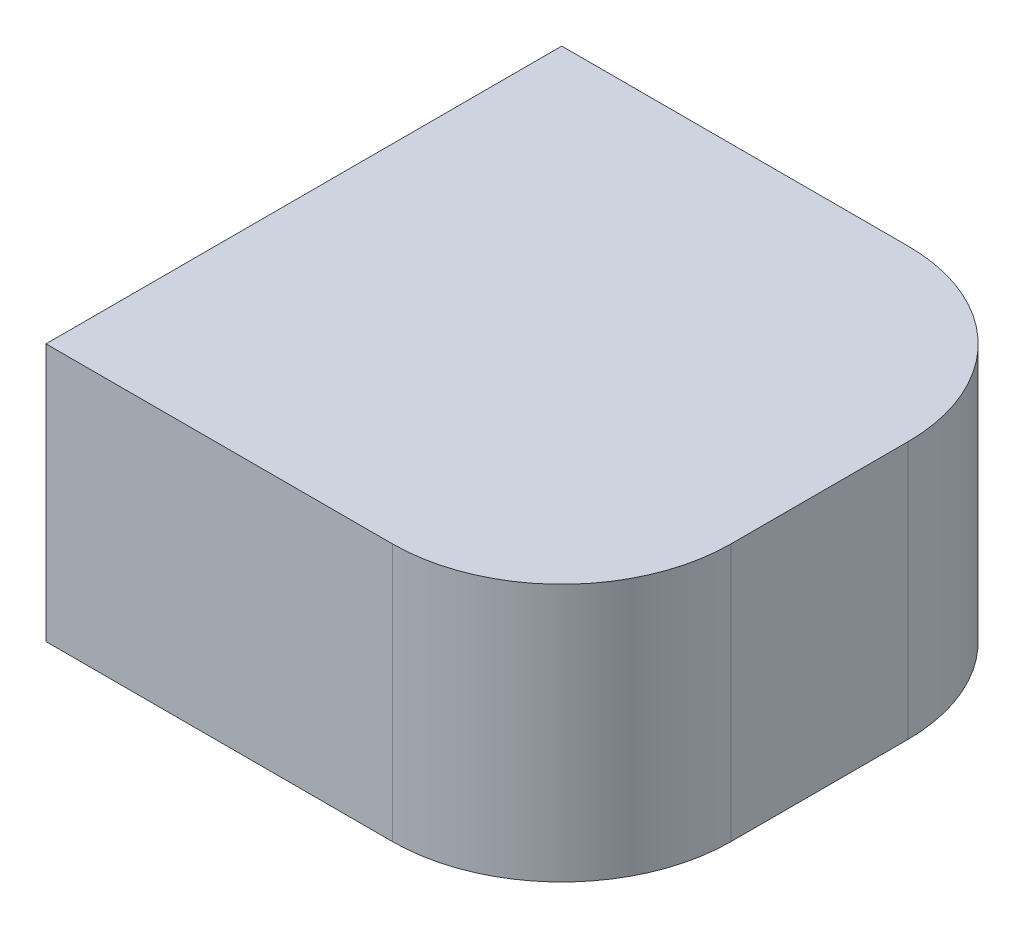
ISO-10303-21;
HEADER;
FILE_DESCRIPTION(('STEP AP214'),'2;1');
FILE_NAME('part.step','',(''),(''),'','','');
FILE_SCHEMA(('AUTOMOTIVE_DESIGN { 1 0 10303 214 1 1 1 1 }'));
ENDSEC;
DATA;
#1=APPLICATION_CONTEXT('core data for automotive mechanical design processes');
#2=APPLICATION_PROTOCOL_DEFINITION('international standard','automotive_design',2000,#1);
#3=PRODUCT_CONTEXT('',#1,'mechanical');
#4=PRODUCT('Part','Part','',(#3));
#5=PRODUCT_RELATED_PRODUCT_CATEGORY('part','',(#4));
#6=PRODUCT_DEFINITION_FORMATION('','',#4);
#7=PRODUCT_DEFINITION_CONTEXT('part definition',#1,'design');
#8=PRODUCT_DEFINITION('design','',#6,#7);
#9=PRODUCT_DEFINITION_SHAPE('','',#8);
#10=(LENGTH_UNIT() NAMED_UNIT(*) SI_UNIT(.MILLI.,.METRE.));
#11=(NAMED_UNIT(*) PLANE_ANGLE_UNIT() SI_UNIT($,.RADIAN.));
#12=(NAMED_UNIT(*) SI_UNIT($,.STERADIAN.) SOLID_ANGLE_UNIT());
#13=UNCERTAINTY_MEASURE_WITH_UNIT(LENGTH_MEASURE(1.E-05),#10,'distance_accuracy_value','');
#14=(GEOMETRIC_REPRESENTATION_CONTEXT(3) GLOBAL_UNCERTAINTY_ASSIGNED_CONTEXT((#13)) GLOBAL_UNIT_ASSIGNED_CONTEXT((#10,
#11,#12)) REPRESENTATION_CONTEXT('',''));
#15=CARTESIAN_POINT('',(0.,0.,0.));
#16=DIRECTION('',(0.,0.,1.));
#17=DIRECTION('',(1.,0.,0.));
#18=AXIS2_PLACEMENT_3D('',#15,#16,#17);
#19=CARTESIAN_POINT('',(-70.,35.,0.));
#20=DIRECTION('',(1.,0.,0.));
#21=DIRECTION('',(0.,0.,-1.));
#22=AXIS2_PLACEMENT_3D('',#19,#20,#21);
#23=PLANE('',#22);
#24=DIRECTION('',(0.,0.,1.));
#25=VECTOR('',#24,1.);
#26=CARTESIAN_POINT('',(-70.,0.,0.));
#27=LINE('',#26,#25);
#28=CARTESIAN_POINT('',(-70.,0.,0.));
#29=VERTEX_POINT('',#28);
#30=CARTESIAN_POINT('',(-70.,0.,70.));
#31=VERTEX_POINT('',#30);
#32=EDGE_CURVE('E140',#29,#31,#27,.T.);
#33=ORIENTED_EDGE('',*,*,#32,.T.);
#34=DIRECTION('',(0.,-1.,0.));
#35=VECTOR('',#34,1.);
#36=CARTESIAN_POINT('',(-70.,35.,70.));
#37=LINE('',#36,#35);
#38=CARTESIAN_POINT('',(-70.,35.,70.));
#39=VERTEX_POINT('',#38);
#40=EDGE_CURVE('E11',#39,#31,#37,.T.);
#41=ORIENTED_EDGE('',*,*,#40,.F.);
#42=DIRECTION('',(0.,0.,1.));
#43=VECTOR('',#42,1.);
#44=CARTESIAN_POINT('',(-70.,35.,0.));
#45=LINE('',#44,#43);
#46=CARTESIAN_POINT('',(-70.,35.,0.));
#47=VERTEX_POINT('',#46);
#48=EDGE_CURVE('E158',#47,#39,#45,.T.);
#49=ORIENTED_EDGE('',*,*,#48,.F.);
#50=DIRECTION('',(0.,-1.,0.));
#51=VECTOR('',#50,1.);
#52=CARTESIAN_POINT('',(-70.,35.,0.));
#53=LINE('',#52,#51);
#54=EDGE_CURVE('E136',#47,#29,#53,.T.);
#55=ORIENTED_EDGE('',*,*,#54,.T.);
#56=EDGE_LOOP('',(#33,#41,#49,#55));
#57=FACE_BOUND('',#56,.T.);
#58=ADVANCED_FACE('F39',(#57),#23,.F.);
#59=CARTESIAN_POINT('',(-23.,35.,70.));
#60=DIRECTION('',(0.,0.,-1.));
#61=DIRECTION('',(-1.,0.,0.));
#62=AXIS2_PLACEMENT_3D('',#59,#60,#61);
#63=PLANE('',#62);
#64=DIRECTION('',(1.,0.,0.));
#65=VECTOR('',#64,1.);
#66=CARTESIAN_POINT('',(-23.,0.,70.));
#67=LINE('',#66,#65);
#68=CARTESIAN_POINT('',(-23.,0.,70.));
#69=VERTEX_POINT('',#68);
#70=EDGE_CURVE('E144',#31,#69,#67,.T.);
#71=ORIENTED_EDGE('',*,*,#70,.T.);
#72=DIRECTION('',(0.,-1.,0.));
#73=VECTOR('',#72,1.);
#74=CARTESIAN_POINT('',(-23.,35.,70.));
#75=LINE('',#74,#73);
#76=CARTESIAN_POINT('',(-23.,35.,70.));
#77=VERTEX_POINT('',#76);
#78=EDGE_CURVE('E47',#77,#69,#75,.T.);
#79=ORIENTED_EDGE('',*,*,#78,.F.);
#80=DIRECTION('',(1.,0.,0.));
#81=VECTOR('',#80,1.);
#82=CARTESIAN_POINT('',(-23.,35.,70.));
#83=LINE('',#82,#81);
#84=EDGE_CURVE('E98',#39,#77,#83,.T.);
#85=ORIENTED_EDGE('',*,*,#84,.F.);
#86=ORIENTED_EDGE('',*,*,#40,.T.);
#87=EDGE_LOOP('',(#71,#79,#85,#86));
#88=FACE_BOUND('',#87,.T.);
#89=ADVANCED_FACE('F264',(#88),#63,.F.);
#90=CARTESIAN_POINT('',(-23.,35.,47.));
#91=DIRECTION('',(0.,-1.,0.));
#92=DIRECTION('',(0.,0.,-1.));
#93=AXIS2_PLACEMENT_3D('',#90,#91,#92);
#94=CYLINDRICAL_SURFACE('',#93,23.);
#95=CARTESIAN_POINT('',(-23.,0.,47.));
#96=DIRECTION('',(0.,1.,0.));
#97=DIRECTION('',(0.,0.,-1.));
#98=AXIS2_PLACEMENT_3D('',#95,#96,#97);
#99=CIRCLE('',#98,23.);
#100=CARTESIAN_POINT('',(0.,0.,47.));
#101=VERTEX_POINT('',#100);
#102=EDGE_CURVE('E148',#69,#101,#99,.T.);
#103=ORIENTED_EDGE('',*,*,#102,.T.);
#104=DIRECTION('',(0.,-1.,0.));
#105=VECTOR('',#104,1.);
#106=CARTESIAN_POINT('',(0.,35.,47.));
#107=LINE('',#106,#105);
#108=CARTESIAN_POINT('',(0.,35.,47.));
#109=VERTEX_POINT('',#108);
#110=EDGE_CURVE('E129',#109,#101,#107,.T.);
#111=ORIENTED_EDGE('',*,*,#110,.F.);
#112=CARTESIAN_POINT('',(-23.,35.,47.));
#113=DIRECTION('',(0.,1.,0.));
#114=DIRECTION('',(0.,0.,-1.));
#115=AXIS2_PLACEMENT_3D('',#112,#113,#114);
#116=CIRCLE('',#115,23.);
#117=EDGE_CURVE('E115',#77,#109,#116,.T.);
#118=ORIENTED_EDGE('',*,*,#117,.F.);
#119=ORIENTED_EDGE('',*,*,#78,.T.);
#120=EDGE_LOOP('',(#103,#111,#118,#119));
#121=FACE_BOUND('',#120,.T.);
#122=ADVANCED_FACE('F168',(#121),#94,.T.);
#123=CARTESIAN_POINT('',(0.,35.,23.0000000000002));
#124=DIRECTION('',(-1.,0.,0.));
#125=DIRECTION('',(0.,0.,1.));
#126=AXIS2_PLACEMENT_3D('',#123,#124,#125);
#127=PLANE('',#126);
#128=DIRECTION('',(0.,0.,-1.));
#129=VECTOR('',#128,1.);
#130=CARTESIAN_POINT('',(0.,0.,23.0000000000002));
#131=LINE('',#130,#129);
#132=CARTESIAN_POINT('',(0.,0.,23.0000000000002));
#133=VERTEX_POINT('',#132);
#134=EDGE_CURVE('E125',#101,#133,#131,.T.);
#135=ORIENTED_EDGE('',*,*,#134,.T.);
#136=DIRECTION('',(0.,-1.,0.));
#137=VECTOR('',#136,1.);
#138=CARTESIAN_POINT('',(0.,35.,23.0000000000002));
#139=LINE('',#138,#137);
#140=CARTESIAN_POINT('',(0.,35.,23.0000000000002));
#141=VERTEX_POINT('',#140);
#142=EDGE_CURVE('E122',#141,#133,#139,.T.);
#143=ORIENTED_EDGE('',*,*,#142,.F.);
#144=DIRECTION('',(0.,0.,-1.));
#145=VECTOR('',#144,1.);
#146=CARTESIAN_POINT('',(0.,35.,23.0000000000002));
#147=LINE('',#146,#145);
#148=EDGE_CURVE('E108',#109,#141,#147,.T.);
#149=ORIENTED_EDGE('',*,*,#148,.F.);
#150=ORIENTED_EDGE('',*,*,#110,.T.);
#151=EDGE_LOOP('',(#135,#143,#149,#150));
#152=FACE_BOUND('',#151,.T.);
#153=ADVANCED_FACE('F123',(#152),#127,.F.);
#154=CARTESIAN_POINT('',(-23.,35.,23.));
#155=DIRECTION('',(0.,-1.,0.));
#156=DIRECTION('',(0.,0.,-1.));
#157=AXIS2_PLACEMENT_3D('',#154,#155,#156);
#158=CYLINDRICAL_SURFACE('',#157,23.);
#159=CARTESIAN_POINT('',(-23.,0.,23.));
#160=DIRECTION('',(0.,1.,0.));
#161=DIRECTION('',(0.,0.,-1.));
#162=AXIS2_PLACEMENT_3D('',#159,#160,#161);
#163=CIRCLE('',#162,23.);
#164=CARTESIAN_POINT('',(-23.0000000000002,0.,0.));
#165=VERTEX_POINT('',#164);
#166=EDGE_CURVE('E153',#133,#165,#163,.T.);
#167=ORIENTED_EDGE('',*,*,#166,.T.);
#168=DIRECTION('',(0.,-1.,0.));
#169=VECTOR('',#168,1.);
#170=CARTESIAN_POINT('',(-23.0000000000002,35.,0.));
#171=LINE('',#170,#169);
#172=CARTESIAN_POINT('',(-23.0000000000002,35.,0.));
#173=VERTEX_POINT('',#172);
#174=EDGE_CURVE('E130',#173,#165,#171,.T.);
#175=ORIENTED_EDGE('',*,*,#174,.F.);
#176=CARTESIAN_POINT('',(-23.,35.,23.));
#177=DIRECTION('',(0.,1.,0.));
#178=DIRECTION('',(0.,0.,-1.));
#179=AXIS2_PLACEMENT_3D('',#176,#177,#178);
#180=CIRCLE('',#179,23.);
#181=EDGE_CURVE('E112',#141,#173,#180,.T.);
#182=ORIENTED_EDGE('',*,*,#181,.F.);
#183=ORIENTED_EDGE('',*,*,#142,.T.);
#184=EDGE_LOOP('',(#167,#175,#182,#183));
#185=FACE_BOUND('',#184,.T.);
#186=ADVANCED_FACE('F132',(#185),#158,.T.);
#187=CARTESIAN_POINT('',(-23.0000000000002,35.,0.));
#188=DIRECTION('',(0.,0.,1.));
#189=DIRECTION('',(1.,0.,0.));
#190=AXIS2_PLACEMENT_3D('',#187,#188,#189);
#191=PLANE('',#190);
#192=DIRECTION('',(-1.,0.,0.));
#193=VECTOR('',#192,1.);
#194=CARTESIAN_POINT('',(-65.,5.5,0.));
#195=LINE('',#194,#193);
#196=CARTESIAN_POINT('',(-65.,5.5,0.));
#197=VERTEX_POINT('',#196);
#198=CARTESIAN_POINT('',(-68.,5.5,0.));
#199=VERTEX_POINT('',#198);
#200=EDGE_CURVE('E205',#197,#199,#195,.T.);
#201=ORIENTED_EDGE('',*,*,#200,.F.);
#202=DIRECTION('',(0.,-1.,0.));
#203=VECTOR('',#202,1.);
#204=CARTESIAN_POINT('',(-65.,29.5,0.));
#205=LINE('',#204,#203);
#206=CARTESIAN_POINT('',(-65.,29.5,0.));
#207=VERTEX_POINT('',#206);
#208=EDGE_CURVE('E54',#207,#197,#205,.T.);
#209=ORIENTED_EDGE('',*,*,#208,.F.);
#210=DIRECTION('',(1.,0.,0.));
#211=VECTOR('',#210,1.);
#212=CARTESIAN_POINT('',(-65.,29.5,0.));
#213=LINE('',#212,#211);
#214=CARTESIAN_POINT('',(-68.,29.5,0.));
#215=VERTEX_POINT('',#214);
#216=EDGE_CURVE('E196',#215,#207,#213,.T.);
#217=ORIENTED_EDGE('',*,*,#216,.F.);
#218=DIRECTION('',(0.,1.,0.));
#219=VECTOR('',#218,1.);
#220=CARTESIAN_POINT('',(-68.,29.5,0.));
#221=LINE('',#220,#219);
#222=EDGE_CURVE('E201',#199,#215,#221,.T.);
#223=ORIENTED_EDGE('',*,*,#222,.F.);
#224=EDGE_LOOP('',(#201,#209,#217,#223));
#225=FACE_BOUND('',#224,.T.);
#226=DIRECTION('',(-1.,0.,0.));
#227=VECTOR('',#226,1.);
#228=CARTESIAN_POINT('',(-23.0000000000002,0.,0.));
#229=LINE('',#228,#227);
#230=EDGE_CURVE('E90',#165,#29,#229,.T.);
#231=ORIENTED_EDGE('',*,*,#230,.T.);
#232=ORIENTED_EDGE('',*,*,#54,.F.);
#233=DIRECTION('',(-1.,0.,0.));
#234=VECTOR('',#233,1.);
#235=CARTESIAN_POINT('',(-23.0000000000002,35.,0.));
#236=LINE('',#235,#234);
#237=EDGE_CURVE('E63',#173,#47,#236,.T.);
#238=ORIENTED_EDGE('',*,*,#237,.F.);
#239=ORIENTED_EDGE('',*,*,#174,.T.);
#240=EDGE_LOOP('',(#231,#232,#238,#239));
#241=FACE_BOUND('',#240,.T.);
#242=ADVANCED_FACE('F172',(#225,#241),#191,.F.);
#243=CARTESIAN_POINT('',(-23.,35.,47.));
#244=DIRECTION('',(0.,-1.,0.));
#245=DIRECTION('',(0.,0.,-1.));
#246=AXIS2_PLACEMENT_3D('',#243,#244,#245);
#247=PLANE('',#246);
#248=ORIENTED_EDGE('',*,*,#48,.T.);
#249=ORIENTED_EDGE('',*,*,#84,.T.);
#250=ORIENTED_EDGE('',*,*,#117,.T.);
#251=ORIENTED_EDGE('',*,*,#148,.T.);
#252=ORIENTED_EDGE('',*,*,#181,.T.);
#253=ORIENTED_EDGE('',*,*,#237,.T.);
#254=EDGE_LOOP('',(#248,#249,#250,#251,#252,#253));
#255=FACE_BOUND('',#254,.T.);
#256=ADVANCED_FACE('F110',(#255),#247,.F.);
#257=CARTESIAN_POINT('',(-23.,0.,47.));
#258=DIRECTION('',(0.,-1.,0.));
#259=DIRECTION('',(0.,0.,-1.));
#260=AXIS2_PLACEMENT_3D('',#257,#258,#259);
#261=PLANE('',#260);
#262=ORIENTED_EDGE('',*,*,#32,.F.);
#263=ORIENTED_EDGE('',*,*,#230,.F.);
#264=ORIENTED_EDGE('',*,*,#166,.F.);
#265=ORIENTED_EDGE('',*,*,#134,.F.);
#266=ORIENTED_EDGE('',*,*,#102,.F.);
#267=ORIENTED_EDGE('',*,*,#70,.F.);
#268=EDGE_LOOP('',(#262,#263,#264,#265,#266,#267));
#269=FACE_BOUND('',#268,.T.);
#270=ADVANCED_FACE('F171',(#269),#261,.T.);
#271=CARTESIAN_POINT('',(-65.,29.5,22.));
#272=DIRECTION('',(1.,0.,0.));
#273=DIRECTION('',(0.,0.,-1.));
#274=AXIS2_PLACEMENT_3D('',#271,#272,#273);
#275=PLANE('',#274);
#276=ORIENTED_EDGE('',*,*,#208,.T.);
#277=DIRECTION('',(0.,0.,-1.));
#278=VECTOR('',#277,1.);
#279=CARTESIAN_POINT('',(-65.,5.5,22.));
#280=LINE('',#279,#278);
#281=CARTESIAN_POINT('',(-65.,5.5,22.));
#282=VERTEX_POINT('',#281);
#283=EDGE_CURVE('E181',#282,#197,#280,.T.);
#284=ORIENTED_EDGE('',*,*,#283,.F.);
#285=DIRECTION('',(0.,-1.,0.));
#286=VECTOR('',#285,1.);
#287=CARTESIAN_POINT('',(-65.,29.5,22.));
#288=LINE('',#287,#286);
#289=CARTESIAN_POINT('',(-65.,29.5,22.));
#290=VERTEX_POINT('',#289);
#291=EDGE_CURVE('E200',#290,#282,#288,.T.);
#292=ORIENTED_EDGE('',*,*,#291,.F.);
#293=DIRECTION('',(0.,0.,-1.));
#294=VECTOR('',#293,1.);
#295=CARTESIAN_POINT('',(-65.,29.5,22.));
#296=LINE('',#295,#294);
#297=EDGE_CURVE('E145',#290,#207,#296,.T.);
#298=ORIENTED_EDGE('',*,*,#297,.T.);
#299=EDGE_LOOP('',(#276,#284,#292,#298));
#300=FACE_BOUND('',#299,.T.);
#301=ADVANCED_FACE('F232',(#300),#275,.F.);
#302=CARTESIAN_POINT('',(-65.,29.5,22.));
#303=DIRECTION('',(0.,1.,0.));
#304=DIRECTION('',(0.,0.,1.));
#305=AXIS2_PLACEMENT_3D('',#302,#303,#304);
#306=PLANE('',#305);
#307=ORIENTED_EDGE('',*,*,#216,.T.);
#308=ORIENTED_EDGE('',*,*,#297,.F.);
#309=DIRECTION('',(1.,0.,0.));
#310=VECTOR('',#309,1.);
#311=CARTESIAN_POINT('',(-65.,29.5,22.));
#312=LINE('',#311,#310);
#313=CARTESIAN_POINT('',(-68.,29.5,22.));
#314=VERTEX_POINT('',#313);
#315=EDGE_CURVE('E186',#314,#290,#312,.T.);
#316=ORIENTED_EDGE('',*,*,#315,.F.);
#317=DIRECTION('',(0.,0.,-1.));
#318=VECTOR('',#317,1.);
#319=CARTESIAN_POINT('',(-68.,29.5,22.));
#320=LINE('',#319,#318);
#321=EDGE_CURVE('E190',#314,#215,#320,.T.);
#322=ORIENTED_EDGE('',*,*,#321,.T.);
#323=EDGE_LOOP('',(#307,#308,#316,#322));
#324=FACE_BOUND('',#323,.T.);
#325=ADVANCED_FACE('F243',(#324),#306,.F.);
#326=CARTESIAN_POINT('',(-68.,29.5,22.));
#327=DIRECTION('',(-1.,0.,0.));
#328=DIRECTION('',(0.,0.,1.));
#329=AXIS2_PLACEMENT_3D('',#326,#327,#328);
#330=PLANE('',#329);
#331=ORIENTED_EDGE('',*,*,#222,.T.);
#332=ORIENTED_EDGE('',*,*,#321,.F.);
#333=DIRECTION('',(0.,1.,0.));
#334=VECTOR('',#333,1.);
#335=CARTESIAN_POINT('',(-68.,29.5,22.));
#336=LINE('',#335,#334);
#337=CARTESIAN_POINT('',(-68.,5.5,22.));
#338=VERTEX_POINT('',#337);
#339=EDGE_CURVE('E214',#338,#314,#336,.T.);
#340=ORIENTED_EDGE('',*,*,#339,.F.);
#341=DIRECTION('',(0.,0.,-1.));
#342=VECTOR('',#341,1.);
#343=CARTESIAN_POINT('',(-68.,5.5,22.));
#344=LINE('',#343,#342);
#345=EDGE_CURVE('E185',#338,#199,#344,.T.);
#346=ORIENTED_EDGE('',*,*,#345,.T.);
#347=EDGE_LOOP('',(#331,#332,#340,#346));
#348=FACE_BOUND('',#347,.T.);
#349=ADVANCED_FACE('F248',(#348),#330,.F.);
#350=CARTESIAN_POINT('',(-65.,5.5,22.));
#351=DIRECTION('',(0.,-1.,0.));
#352=DIRECTION('',(0.,0.,-1.));
#353=AXIS2_PLACEMENT_3D('',#350,#351,#352);
#354=PLANE('',#353);
#355=ORIENTED_EDGE('',*,*,#200,.T.);
#356=ORIENTED_EDGE('',*,*,#345,.F.);
#357=DIRECTION('',(-1.,0.,0.));
#358=VECTOR('',#357,1.);
#359=CARTESIAN_POINT('',(-65.,5.5,22.));
#360=LINE('',#359,#358);
#361=EDGE_CURVE('E218',#282,#338,#360,.T.);
#362=ORIENTED_EDGE('',*,*,#361,.F.);
#363=ORIENTED_EDGE('',*,*,#283,.T.);
#364=EDGE_LOOP('',(#355,#356,#362,#363));
#365=FACE_BOUND('',#364,.T.);
#366=ADVANCED_FACE('F253',(#365),#354,.F.);
#367=CARTESIAN_POINT('',(0.,0.,22.));
#368=DIRECTION('',(0.,0.,-1.));
#369=DIRECTION('',(-1.,0.,0.));
#370=AXIS2_PLACEMENT_3D('',#367,#368,#369);
#371=PLANE('',#370);
#372=ORIENTED_EDGE('',*,*,#291,.T.);
#373=ORIENTED_EDGE('',*,*,#361,.T.);
#374=ORIENTED_EDGE('',*,*,#339,.T.);
#375=ORIENTED_EDGE('',*,*,#315,.T.);
#376=EDGE_LOOP('',(#372,#373,#374,#375));
#377=FACE_BOUND('',#376,.T.);
#378=ADVANCED_FACE('F227',(#377),#371,.T.);
#379=CLOSED_SHELL('',(#58,#89,#122,#153,#186,#242,#256,#270,#301,#325,#349,#366,#378));
#380=MANIFOLD_SOLID_BREP('B2',#379);
#381=ADVANCED_BREP_SHAPE_REPRESENTATION('',(#18,#380),#14);
#382=SHAPE_DEFINITION_REPRESENTATION(#9,#381);
ENDSEC;
END-ISO-10303-21;
